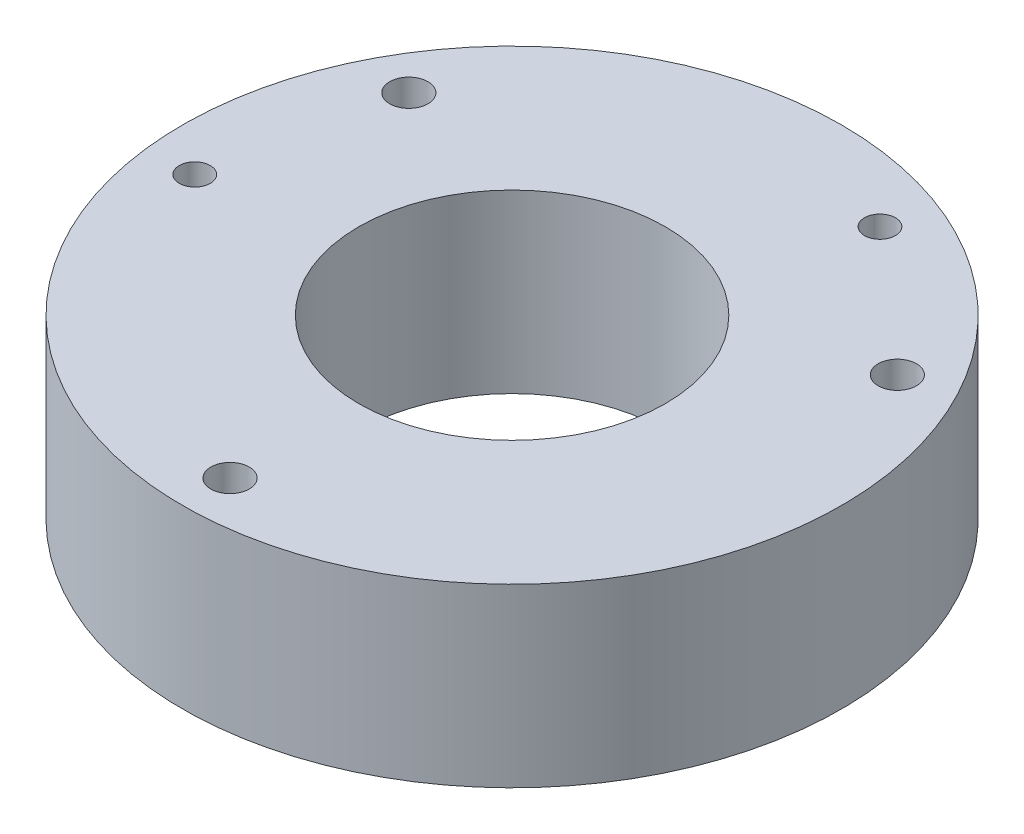
ISO-10303-21;
HEADER;
FILE_DESCRIPTION(('STEP AP214'),'2;1');
FILE_NAME('part.step','',(''),(''),'','','');
FILE_SCHEMA(('AUTOMOTIVE_DESIGN { 1 0 10303 214 1 1 1 1 }'));
ENDSEC;
DATA;
#1=APPLICATION_CONTEXT('core data for automotive mechanical design processes');
#2=APPLICATION_PROTOCOL_DEFINITION('international standard','automotive_design',2000,#1);
#3=PRODUCT_CONTEXT('',#1,'mechanical');
#4=PRODUCT('Part','Part','',(#3));
#5=PRODUCT_RELATED_PRODUCT_CATEGORY('part','',(#4));
#6=PRODUCT_DEFINITION_FORMATION('','',#4);
#7=PRODUCT_DEFINITION_CONTEXT('part definition',#1,'design');
#8=PRODUCT_DEFINITION('design','',#6,#7);
#9=PRODUCT_DEFINITION_SHAPE('','',#8);
#10=(LENGTH_UNIT() NAMED_UNIT(*) SI_UNIT(.MILLI.,.METRE.));
#11=(NAMED_UNIT(*) PLANE_ANGLE_UNIT() SI_UNIT($,.RADIAN.));
#12=(NAMED_UNIT(*) SI_UNIT($,.STERADIAN.) SOLID_ANGLE_UNIT());
#13=UNCERTAINTY_MEASURE_WITH_UNIT(LENGTH_MEASURE(1.E-05),#10,'distance_accuracy_value','');
#14=(GEOMETRIC_REPRESENTATION_CONTEXT(3) GLOBAL_UNCERTAINTY_ASSIGNED_CONTEXT((#13)) GLOBAL_UNIT_ASSIGNED_CONTEXT((#10,
#11,#12)) REPRESENTATION_CONTEXT('',''));
#15=CARTESIAN_POINT('',(0.,0.,0.));
#16=DIRECTION('',(0.,0.,1.));
#17=DIRECTION('',(1.,0.,0.));
#18=AXIS2_PLACEMENT_3D('',#15,#16,#17);
#19=CARTESIAN_POINT('',(5.1,4.99999999999545,-10.8));
#20=DIRECTION('',(0.,-1.,0.));
#21=DIRECTION('',(0.,0.,-1.));
#22=AXIS2_PLACEMENT_3D('',#19,#20,#21);
#23=CONICAL_SURFACE('',#22,0.900000000018919,1.0297442586507);
#24=CARTESIAN_POINT('',(5.1,5.54077455717561,-10.799999999989));
#25=VERTEX_POINT('',#24);
#26=VERTEX_LOOP('',#25);
#27=FACE_BOUND('',#26,.T.);
#28=CARTESIAN_POINT('',(5.1,4.99999999999999,-10.8));
#29=DIRECTION('',(0.,-1.,0.));
#30=DIRECTION('',(0.,0.,-1.));
#31=AXIS2_PLACEMENT_3D('',#28,#29,#30);
#32=CIRCLE('',#31,0.9);
#33=CARTESIAN_POINT('',(5.1,4.99999999999999,-11.7));
#34=VERTEX_POINT('',#33);
#35=EDGE_CURVE('E43',#34,#34,#32,.T.);
#36=ORIENTED_EDGE('',*,*,#35,.T.);
#37=EDGE_LOOP('',(#36));
#38=FACE_BOUND('',#37,.T.);
#39=ADVANCED_FACE('F16',(#27,#38),#23,.F.);
#40=CARTESIAN_POINT('',(-6.8,5.0000000000523,9.8));
#41=DIRECTION('',(0.,-1.,0.));
#42=DIRECTION('',(0.,0.,-1.));
#43=AXIS2_PLACEMENT_3D('',#40,#41,#42);
#44=CONICAL_SURFACE('',#43,0.899999999903504,1.02974425865986);
#45=CARTESIAN_POINT('',(-6.8,5.54077455714719,9.79999999995584));
#46=VERTEX_POINT('',#45);
#47=VERTEX_LOOP('',#46);
#48=FACE_BOUND('',#47,.T.);
#49=CARTESIAN_POINT('',(-6.8,4.99999999999999,9.8));
#50=DIRECTION('',(0.,-1.,0.));
#51=DIRECTION('',(0.,0.,-1.));
#52=AXIS2_PLACEMENT_3D('',#49,#50,#51);
#53=CIRCLE('',#52,0.9);
#54=CARTESIAN_POINT('',(-6.8,4.99999999999999,8.9));
#55=VERTEX_POINT('',#54);
#56=EDGE_CURVE('E45',#55,#55,#53,.T.);
#57=ORIENTED_EDGE('',*,*,#56,.T.);
#58=EDGE_LOOP('',(#57));
#59=FACE_BOUND('',#58,.T.);
#60=ADVANCED_FACE('F40',(#48,#59),#44,.F.);
#61=CARTESIAN_POINT('',(5.1,0.,-10.8));
#62=DIRECTION('',(0.,-1.,0.));
#63=DIRECTION('',(0.,0.,-1.));
#64=AXIS2_PLACEMENT_3D('',#61,#62,#63);
#65=CYLINDRICAL_SURFACE('',#64,0.9);
#66=ORIENTED_EDGE('',*,*,#35,.F.);
#67=EDGE_LOOP('',(#66));
#68=FACE_BOUND('',#67,.T.);
#69=CARTESIAN_POINT('',(5.1,3.,-10.8));
#70=DIRECTION('',(0.,-1.,0.));
#71=DIRECTION('',(0.,0.,-1.));
#72=AXIS2_PLACEMENT_3D('',#69,#70,#71);
#73=CIRCLE('',#72,0.9);
#74=CARTESIAN_POINT('',(5.1,3.,-11.7));
#75=VERTEX_POINT('',#74);
#76=EDGE_CURVE('E19',#75,#75,#73,.T.);
#77=ORIENTED_EDGE('',*,*,#76,.T.);
#78=EDGE_LOOP('',(#77));
#79=FACE_BOUND('',#78,.T.);
#80=ADVANCED_FACE('F116',(#68,#79),#65,.F.);
#81=CARTESIAN_POINT('',(-6.8,0.,9.8));
#82=DIRECTION('',(0.,-1.,0.));
#83=DIRECTION('',(0.,0.,-1.));
#84=AXIS2_PLACEMENT_3D('',#81,#82,#83);
#85=CYLINDRICAL_SURFACE('',#84,0.9);
#86=ORIENTED_EDGE('',*,*,#56,.F.);
#87=EDGE_LOOP('',(#86));
#88=FACE_BOUND('',#87,.T.);
#89=CARTESIAN_POINT('',(-6.8,3.,9.8));
#90=DIRECTION('',(0.,-1.,0.));
#91=DIRECTION('',(0.,0.,-1.));
#92=AXIS2_PLACEMENT_3D('',#89,#90,#91);
#93=CIRCLE('',#92,0.9);
#94=CARTESIAN_POINT('',(-6.8,3.,8.9));
#95=VERTEX_POINT('',#94);
#96=EDGE_CURVE('E107',#95,#95,#93,.T.);
#97=ORIENTED_EDGE('',*,*,#96,.T.);
#98=EDGE_LOOP('',(#97));
#99=FACE_BOUND('',#98,.T.);
#100=ADVANCED_FACE('F204',(#88,#99),#85,.F.);
#101=CARTESIAN_POINT('',(-18.3,6.49999999995998,2.4));
#102=DIRECTION('',(0.,1.,0.));
#103=DIRECTION('',(0.,0.,1.));
#104=AXIS2_PLACEMENT_3D('',#101,#102,#103);
#105=CONICAL_SURFACE('',#104,0.899999999910601,1.02974425851516);
#106=CARTESIAN_POINT('',(-18.3,5.95922544277983,2.40000000010809));
#107=VERTEX_POINT('',#106);
#108=VERTEX_LOOP('',#107);
#109=FACE_BOUND('',#108,.T.);
#110=CARTESIAN_POINT('',(-18.3,6.5,2.4));
#111=DIRECTION('',(0.,1.,0.));
#112=DIRECTION('',(0.,0.,1.));
#113=AXIS2_PLACEMENT_3D('',#110,#111,#112);
#114=CIRCLE('',#113,0.900000000000001);
#115=CARTESIAN_POINT('',(-18.3,6.5,3.3));
#116=VERTEX_POINT('',#115);
#117=EDGE_CURVE('E109',#116,#116,#114,.T.);
#118=ORIENTED_EDGE('',*,*,#117,.T.);
#119=EDGE_LOOP('',(#118));
#120=FACE_BOUND('',#119,.T.);
#121=ADVANCED_FACE('F132',(#109,#120),#105,.F.);
#122=CARTESIAN_POINT('',(7.,6.4999999998463,-17.));
#123=DIRECTION('',(0.,1.,0.));
#124=DIRECTION('',(-1.,0.,0.));
#125=AXIS2_PLACEMENT_3D('',#122,#123,#124);
#126=CONICAL_SURFACE('',#125,0.899999999778175,1.02974425840377);
#127=CARTESIAN_POINT('',(7.,5.95922544283667,-16.9999999997117));
#128=VERTEX_POINT('',#127);
#129=VERTEX_LOOP('',#128);
#130=FACE_BOUND('',#129,.T.);
#131=CARTESIAN_POINT('',(7.,6.5,-17.));
#132=DIRECTION('',(0.,1.,0.));
#133=DIRECTION('',(0.,0.,1.));
#134=AXIS2_PLACEMENT_3D('',#131,#132,#133);
#135=CIRCLE('',#134,0.900000000000001);
#136=CARTESIAN_POINT('',(7.,6.5,-16.1));
#137=VERTEX_POINT('',#136);
#138=EDGE_CURVE('E106',#137,#137,#135,.T.);
#139=ORIENTED_EDGE('',*,*,#138,.T.);
#140=EDGE_LOOP('',(#139));
#141=FACE_BOUND('',#140,.T.);
#142=ADVANCED_FACE('F121',(#130,#141),#126,.F.);
#143=CARTESIAN_POINT('',(6.,3.,-10.8));
#144=DIRECTION('',(0.,1.,0.));
#145=DIRECTION('',(0.,0.,1.));
#146=AXIS2_PLACEMENT_3D('',#143,#144,#145);
#147=PLANE('',#146);
#148=CARTESIAN_POINT('',(5.1,3.,-10.8));
#149=DIRECTION('',(0.,-1.,0.));
#150=DIRECTION('',(0.,0.,-1.));
#151=AXIS2_PLACEMENT_3D('',#148,#149,#150);
#152=CIRCLE('',#151,1.01);
#153=CARTESIAN_POINT('',(5.1,3.,-11.81));
#154=VERTEX_POINT('',#153);
#155=EDGE_CURVE('E104',#154,#154,#152,.T.);
#156=ORIENTED_EDGE('',*,*,#155,.T.);
#157=EDGE_LOOP('',(#156));
#158=FACE_BOUND('',#157,.T.);
#159=ORIENTED_EDGE('',*,*,#76,.F.);
#160=EDGE_LOOP('',(#159));
#161=FACE_BOUND('',#160,.T.);
#162=ADVANCED_FACE('F118',(#158,#161),#147,.F.);
#163=CARTESIAN_POINT('',(-5.9,3.,9.8));
#164=DIRECTION('',(0.,1.,0.));
#165=DIRECTION('',(0.,0.,1.));
#166=AXIS2_PLACEMENT_3D('',#163,#164,#165);
#167=PLANE('',#166);
#168=CARTESIAN_POINT('',(-6.8,3.,9.8));
#169=DIRECTION('',(0.,-1.,0.));
#170=DIRECTION('',(0.,0.,-1.));
#171=AXIS2_PLACEMENT_3D('',#168,#169,#170);
#172=CIRCLE('',#171,1.01);
#173=CARTESIAN_POINT('',(-6.8,3.,8.79));
#174=VERTEX_POINT('',#173);
#175=EDGE_CURVE('E101',#174,#174,#172,.T.);
#176=ORIENTED_EDGE('',*,*,#175,.T.);
#177=EDGE_LOOP('',(#176));
#178=FACE_BOUND('',#177,.T.);
#179=ORIENTED_EDGE('',*,*,#96,.F.);
#180=EDGE_LOOP('',(#179));
#181=FACE_BOUND('',#180,.T.);
#182=ADVANCED_FACE('F120',(#178,#181),#167,.F.);
#183=CARTESIAN_POINT('',(-18.3,11.5,2.4));
#184=DIRECTION('',(0.,1.,0.));
#185=DIRECTION('',(0.,0.,1.));
#186=AXIS2_PLACEMENT_3D('',#183,#184,#185);
#187=CYLINDRICAL_SURFACE('',#186,0.900000000000001);
#188=ORIENTED_EDGE('',*,*,#117,.F.);
#189=EDGE_LOOP('',(#188));
#190=FACE_BOUND('',#189,.T.);
#191=CARTESIAN_POINT('',(-18.3,8.5,2.4));
#192=DIRECTION('',(0.,1.,0.));
#193=DIRECTION('',(0.,0.,1.));
#194=AXIS2_PLACEMENT_3D('',#191,#192,#193);
#195=CIRCLE('',#194,0.900000000000001);
#196=CARTESIAN_POINT('',(-18.3,8.5,3.3));
#197=VERTEX_POINT('',#196);
#198=EDGE_CURVE('E98',#197,#197,#195,.T.);
#199=ORIENTED_EDGE('',*,*,#198,.T.);
#200=EDGE_LOOP('',(#199));
#201=FACE_BOUND('',#200,.T.);
#202=ADVANCED_FACE('F129',(#190,#201),#187,.F.);
#203=CARTESIAN_POINT('',(7.,11.5,-17.));
#204=DIRECTION('',(0.,1.,0.));
#205=DIRECTION('',(0.,0.,1.));
#206=AXIS2_PLACEMENT_3D('',#203,#204,#205);
#207=CYLINDRICAL_SURFACE('',#206,0.900000000000001);
#208=ORIENTED_EDGE('',*,*,#138,.F.);
#209=EDGE_LOOP('',(#208));
#210=FACE_BOUND('',#209,.T.);
#211=CARTESIAN_POINT('',(7.,8.5,-17.));
#212=DIRECTION('',(0.,1.,0.));
#213=DIRECTION('',(0.,0.,1.));
#214=AXIS2_PLACEMENT_3D('',#211,#212,#213);
#215=CIRCLE('',#214,0.900000000000001);
#216=CARTESIAN_POINT('',(7.,8.5,-16.1));
#217=VERTEX_POINT('',#216);
#218=EDGE_CURVE('E95',#217,#217,#215,.T.);
#219=ORIENTED_EDGE('',*,*,#218,.T.);
#220=EDGE_LOOP('',(#219));
#221=FACE_BOUND('',#220,.T.);
#222=ADVANCED_FACE('F189',(#210,#221),#207,.F.);
#223=CARTESIAN_POINT('',(5.1,0.,-10.8));
#224=DIRECTION('',(0.,-1.,0.));
#225=DIRECTION('',(0.,0.,-1.));
#226=AXIS2_PLACEMENT_3D('',#223,#224,#225);
#227=CYLINDRICAL_SURFACE('',#226,1.01);
#228=ORIENTED_EDGE('',*,*,#155,.F.);
#229=EDGE_LOOP('',(#228));
#230=FACE_BOUND('',#229,.T.);
#231=CARTESIAN_POINT('',(5.1,0.,-10.8));
#232=DIRECTION('',(0.,-1.,0.));
#233=DIRECTION('',(0.,0.,-1.));
#234=AXIS2_PLACEMENT_3D('',#231,#232,#233);
#235=CIRCLE('',#234,1.01);
#236=CARTESIAN_POINT('',(5.1,0.,-11.81));
#237=VERTEX_POINT('',#236);
#238=EDGE_CURVE('E92',#237,#237,#235,.T.);
#239=ORIENTED_EDGE('',*,*,#238,.T.);
#240=EDGE_LOOP('',(#239));
#241=FACE_BOUND('',#240,.T.);
#242=ADVANCED_FACE('F185',(#230,#241),#227,.F.);
#243=CARTESIAN_POINT('',(-6.8,0.,9.8));
#244=DIRECTION('',(0.,-1.,0.));
#245=DIRECTION('',(0.,0.,-1.));
#246=AXIS2_PLACEMENT_3D('',#243,#244,#245);
#247=CYLINDRICAL_SURFACE('',#246,1.01);
#248=ORIENTED_EDGE('',*,*,#175,.F.);
#249=EDGE_LOOP('',(#248));
#250=FACE_BOUND('',#249,.T.);
#251=CARTESIAN_POINT('',(-6.8,0.,9.8));
#252=DIRECTION('',(0.,-1.,0.));
#253=DIRECTION('',(0.,0.,-1.));
#254=AXIS2_PLACEMENT_3D('',#251,#252,#253);
#255=CIRCLE('',#254,1.01);
#256=CARTESIAN_POINT('',(-6.8,0.,8.79));
#257=VERTEX_POINT('',#256);
#258=EDGE_CURVE('E89',#257,#257,#255,.T.);
#259=ORIENTED_EDGE('',*,*,#258,.T.);
#260=EDGE_LOOP('',(#259));
#261=FACE_BOUND('',#260,.T.);
#262=ADVANCED_FACE('F181',(#250,#261),#247,.F.);
#263=CARTESIAN_POINT('',(-17.4,8.5,2.4));
#264=DIRECTION('',(0.,-1.,0.));
#265=DIRECTION('',(0.,0.,-1.));
#266=AXIS2_PLACEMENT_3D('',#263,#264,#265);
#267=PLANE('',#266);
#268=CARTESIAN_POINT('',(-18.3,8.5,2.4));
#269=DIRECTION('',(0.,1.,0.));
#270=DIRECTION('',(0.,0.,1.));
#271=AXIS2_PLACEMENT_3D('',#268,#269,#270);
#272=CIRCLE('',#271,1.01);
#273=CARTESIAN_POINT('',(-18.3,8.5,3.41));
#274=VERTEX_POINT('',#273);
#275=EDGE_CURVE('E86',#274,#274,#272,.T.);
#276=ORIENTED_EDGE('',*,*,#275,.T.);
#277=EDGE_LOOP('',(#276));
#278=FACE_BOUND('',#277,.T.);
#279=ORIENTED_EDGE('',*,*,#198,.F.);
#280=EDGE_LOOP('',(#279));
#281=FACE_BOUND('',#280,.T.);
#282=ADVANCED_FACE('F177',(#278,#281),#267,.F.);
#283=CARTESIAN_POINT('',(7.9,8.5,-17.));
#284=DIRECTION('',(0.,-1.,0.));
#285=DIRECTION('',(0.,0.,-1.));
#286=AXIS2_PLACEMENT_3D('',#283,#284,#285);
#287=PLANE('',#286);
#288=CARTESIAN_POINT('',(7.,8.5,-17.));
#289=DIRECTION('',(0.,1.,0.));
#290=DIRECTION('',(0.,0.,1.));
#291=AXIS2_PLACEMENT_3D('',#288,#289,#290);
#292=CIRCLE('',#291,1.01);
#293=CARTESIAN_POINT('',(7.,8.5,-15.99));
#294=VERTEX_POINT('',#293);
#295=EDGE_CURVE('E83',#294,#294,#292,.T.);
#296=ORIENTED_EDGE('',*,*,#295,.T.);
#297=EDGE_LOOP('',(#296));
#298=FACE_BOUND('',#297,.T.);
#299=ORIENTED_EDGE('',*,*,#218,.F.);
#300=EDGE_LOOP('',(#299));
#301=FACE_BOUND('',#300,.T.);
#302=ADVANCED_FACE('F173',(#298,#301),#287,.F.);
#303=CARTESIAN_POINT('',(0.,0.,0.));
#304=DIRECTION('',(0.,1.,0.));
#305=DIRECTION('',(0.,0.,1.));
#306=AXIS2_PLACEMENT_3D('',#303,#304,#305);
#307=PLANE('',#306);
#308=CARTESIAN_POINT('',(0.,0.,0.));
#309=DIRECTION('',(0.,-1.,0.));
#310=DIRECTION('',(0.,0.,-1.));
#311=AXIS2_PLACEMENT_3D('',#308,#309,#310);
#312=CIRCLE('',#311,10.);
#313=CARTESIAN_POINT('',(0.,0.,-10.));
#314=VERTEX_POINT('',#313);
#315=EDGE_CURVE('E68',#314,#314,#312,.F.);
#316=ORIENTED_EDGE('',*,*,#315,.T.);
#317=EDGE_LOOP('',(#316));
#318=FACE_BOUND('',#317,.T.);
#319=CARTESIAN_POINT('',(0.,0.,0.));
#320=DIRECTION('',(0.,-1.,0.));
#321=DIRECTION('',(0.,0.,-1.));
#322=AXIS2_PLACEMENT_3D('',#319,#320,#321);
#323=CIRCLE('',#322,21.5);
#324=CARTESIAN_POINT('',(0.,0.,-21.5));
#325=VERTEX_POINT('',#324);
#326=EDGE_CURVE('E71',#325,#325,#323,.F.);
#327=ORIENTED_EDGE('',*,*,#326,.F.);
#328=EDGE_LOOP('',(#327));
#329=FACE_BOUND('',#328,.T.);
#330=CARTESIAN_POINT('',(0.,0.,18.4));
#331=DIRECTION('',(0.,1.,0.));
#332=DIRECTION('',(0.,0.,1.));
#333=AXIS2_PLACEMENT_3D('',#330,#331,#332);
#334=CIRCLE('',#333,1.24999999999999);
#335=CARTESIAN_POINT('',(0.,0.,19.65));
#336=VERTEX_POINT('',#335);
#337=EDGE_CURVE('E74',#336,#336,#334,.T.);
#338=ORIENTED_EDGE('',*,*,#337,.T.);
#339=EDGE_LOOP('',(#338));
#340=FACE_BOUND('',#339,.T.);
#341=CARTESIAN_POINT('',(15.9348674296336,0.,-9.20000000000008));
#342=DIRECTION('',(0.,1.,0.));
#343=DIRECTION('',(0.,0.,1.));
#344=AXIS2_PLACEMENT_3D('',#341,#342,#343);
#345=CIRCLE('',#344,1.24999999999999);
#346=CARTESIAN_POINT('',(15.9348674296336,0.,-7.95000000000009));
#347=VERTEX_POINT('',#346);
#348=EDGE_CURVE('E77',#347,#347,#345,.T.);
#349=ORIENTED_EDGE('',*,*,#348,.T.);
#350=EDGE_LOOP('',(#349));
#351=FACE_BOUND('',#350,.T.);
#352=CARTESIAN_POINT('',(-15.9348674296336,0.,-9.20000000000007));
#353=DIRECTION('',(0.,1.,0.));
#354=DIRECTION('',(0.,0.,1.));
#355=AXIS2_PLACEMENT_3D('',#352,#353,#354);
#356=CIRCLE('',#355,1.24999999999999);
#357=CARTESIAN_POINT('',(-15.9348674296336,0.,-7.95000000000008));
#358=VERTEX_POINT('',#357);
#359=EDGE_CURVE('E80',#358,#358,#356,.T.);
#360=ORIENTED_EDGE('',*,*,#359,.T.);
#361=EDGE_LOOP('',(#360));
#362=FACE_BOUND('',#361,.T.);
#363=ORIENTED_EDGE('',*,*,#258,.F.);
#364=EDGE_LOOP('',(#363));
#365=FACE_BOUND('',#364,.T.);
#366=ORIENTED_EDGE('',*,*,#238,.F.);
#367=EDGE_LOOP('',(#366));
#368=FACE_BOUND('',#367,.T.);
#369=ADVANCED_FACE('F169',(#318,#329,#340,#351,#362,#365,#368),#307,.F.);
#370=CARTESIAN_POINT('',(-18.3,11.5,2.4));
#371=DIRECTION('',(0.,1.,0.));
#372=DIRECTION('',(0.,0.,1.));
#373=AXIS2_PLACEMENT_3D('',#370,#371,#372);
#374=CYLINDRICAL_SURFACE('',#373,1.01);
#375=CARTESIAN_POINT('',(-18.3,11.5,2.4));
#376=DIRECTION('',(0.,1.,0.));
#377=DIRECTION('',(0.,0.,1.));
#378=AXIS2_PLACEMENT_3D('',#375,#376,#377);
#379=CIRCLE('',#378,1.01);
#380=CARTESIAN_POINT('',(-18.3,11.5,3.41));
#381=VERTEX_POINT('',#380);
#382=EDGE_CURVE('E65',#381,#381,#379,.F.);
#383=ORIENTED_EDGE('',*,*,#382,.F.);
#384=EDGE_LOOP('',(#383));
#385=FACE_BOUND('',#384,.T.);
#386=ORIENTED_EDGE('',*,*,#275,.F.);
#387=EDGE_LOOP('',(#386));
#388=FACE_BOUND('',#387,.T.);
#389=ADVANCED_FACE('F165',(#385,#388),#374,.F.);
#390=CARTESIAN_POINT('',(7.,11.5,-17.));
#391=DIRECTION('',(0.,1.,0.));
#392=DIRECTION('',(0.,0.,1.));
#393=AXIS2_PLACEMENT_3D('',#390,#391,#392);
#394=CYLINDRICAL_SURFACE('',#393,1.01);
#395=CARTESIAN_POINT('',(7.,11.5,-17.));
#396=DIRECTION('',(0.,1.,0.));
#397=DIRECTION('',(0.,0.,1.));
#398=AXIS2_PLACEMENT_3D('',#395,#396,#397);
#399=CIRCLE('',#398,1.01);
#400=CARTESIAN_POINT('',(7.,11.5,-15.99));
#401=VERTEX_POINT('',#400);
#402=EDGE_CURVE('E62',#401,#401,#399,.F.);
#403=ORIENTED_EDGE('',*,*,#402,.F.);
#404=EDGE_LOOP('',(#403));
#405=FACE_BOUND('',#404,.T.);
#406=ORIENTED_EDGE('',*,*,#295,.F.);
#407=EDGE_LOOP('',(#406));
#408=FACE_BOUND('',#407,.T.);
#409=ADVANCED_FACE('F161',(#405,#408),#394,.F.);
#410=CARTESIAN_POINT('',(-15.9348674296336,11.5,-9.20000000000007));
#411=DIRECTION('',(0.,1.,0.));
#412=DIRECTION('',(0.,0.,1.));
#413=AXIS2_PLACEMENT_3D('',#410,#411,#412);
#414=CYLINDRICAL_SURFACE('',#413,1.24999999999999);
#415=CARTESIAN_POINT('',(-15.9348674296336,11.5,-9.20000000000007));
#416=DIRECTION('',(0.,1.,0.));
#417=DIRECTION('',(0.,0.,1.));
#418=AXIS2_PLACEMENT_3D('',#415,#416,#417);
#419=CIRCLE('',#418,1.24999999999999);
#420=CARTESIAN_POINT('',(-15.9348674296336,11.5,-7.95000000000008));
#421=VERTEX_POINT('',#420);
#422=EDGE_CURVE('E59',#421,#421,#419,.F.);
#423=ORIENTED_EDGE('',*,*,#422,.F.);
#424=EDGE_LOOP('',(#423));
#425=FACE_BOUND('',#424,.T.);
#426=ORIENTED_EDGE('',*,*,#359,.F.);
#427=EDGE_LOOP('',(#426));
#428=FACE_BOUND('',#427,.T.);
#429=ADVANCED_FACE('F157',(#425,#428),#414,.F.);
#430=CARTESIAN_POINT('',(15.9348674296336,11.5,-9.20000000000008));
#431=DIRECTION('',(0.,1.,0.));
#432=DIRECTION('',(0.,0.,1.));
#433=AXIS2_PLACEMENT_3D('',#430,#431,#432);
#434=CYLINDRICAL_SURFACE('',#433,1.24999999999999);
#435=CARTESIAN_POINT('',(15.9348674296336,11.5,-9.20000000000008));
#436=DIRECTION('',(0.,1.,0.));
#437=DIRECTION('',(0.,0.,1.));
#438=AXIS2_PLACEMENT_3D('',#435,#436,#437);
#439=CIRCLE('',#438,1.24999999999999);
#440=CARTESIAN_POINT('',(15.9348674296336,11.5,-7.95000000000009));
#441=VERTEX_POINT('',#440);
#442=EDGE_CURVE('E56',#441,#441,#439,.F.);
#443=ORIENTED_EDGE('',*,*,#442,.F.);
#444=EDGE_LOOP('',(#443));
#445=FACE_BOUND('',#444,.T.);
#446=ORIENTED_EDGE('',*,*,#348,.F.);
#447=EDGE_LOOP('',(#446));
#448=FACE_BOUND('',#447,.T.);
#449=ADVANCED_FACE('F153',(#445,#448),#434,.F.);
#450=CARTESIAN_POINT('',(0.,11.5,18.4));
#451=DIRECTION('',(0.,1.,0.));
#452=DIRECTION('',(0.,0.,1.));
#453=AXIS2_PLACEMENT_3D('',#450,#451,#452);
#454=CYLINDRICAL_SURFACE('',#453,1.24999999999999);
#455=CARTESIAN_POINT('',(0.,11.5,18.4));
#456=DIRECTION('',(0.,1.,0.));
#457=DIRECTION('',(0.,0.,1.));
#458=AXIS2_PLACEMENT_3D('',#455,#456,#457);
#459=CIRCLE('',#458,1.24999999999999);
#460=CARTESIAN_POINT('',(0.,11.5,19.65));
#461=VERTEX_POINT('',#460);
#462=EDGE_CURVE('E53',#461,#461,#459,.F.);
#463=ORIENTED_EDGE('',*,*,#462,.F.);
#464=EDGE_LOOP('',(#463));
#465=FACE_BOUND('',#464,.T.);
#466=ORIENTED_EDGE('',*,*,#337,.F.);
#467=EDGE_LOOP('',(#466));
#468=FACE_BOUND('',#467,.T.);
#469=ADVANCED_FACE('F149',(#465,#468),#454,.F.);
#470=CARTESIAN_POINT('',(0.,11.5,0.));
#471=DIRECTION('',(0.,-1.,0.));
#472=DIRECTION('',(0.,0.,-1.));
#473=AXIS2_PLACEMENT_3D('',#470,#471,#472);
#474=CYLINDRICAL_SURFACE('',#473,21.5);
#475=ORIENTED_EDGE('',*,*,#326,.T.);
#476=EDGE_LOOP('',(#475));
#477=FACE_BOUND('',#476,.T.);
#478=CARTESIAN_POINT('',(0.,11.5,0.));
#479=DIRECTION('',(0.,-1.,0.));
#480=DIRECTION('',(0.,0.,-1.));
#481=AXIS2_PLACEMENT_3D('',#478,#479,#480);
#482=CIRCLE('',#481,21.5);
#483=CARTESIAN_POINT('',(0.,11.5,-21.5));
#484=VERTEX_POINT('',#483);
#485=EDGE_CURVE('E25',#484,#484,#482,.F.);
#486=ORIENTED_EDGE('',*,*,#485,.F.);
#487=EDGE_LOOP('',(#486));
#488=FACE_BOUND('',#487,.T.);
#489=ADVANCED_FACE('F142',(#477,#488),#474,.T.);
#490=CARTESIAN_POINT('',(0.,11.5,0.));
#491=DIRECTION('',(0.,-1.,0.));
#492=DIRECTION('',(0.,0.,-1.));
#493=AXIS2_PLACEMENT_3D('',#490,#491,#492);
#494=CYLINDRICAL_SURFACE('',#493,10.);
#495=CARTESIAN_POINT('',(0.,11.5,0.));
#496=DIRECTION('',(0.,-1.,0.));
#497=DIRECTION('',(0.,0.,-1.));
#498=AXIS2_PLACEMENT_3D('',#495,#496,#497);
#499=CIRCLE('',#498,10.);
#500=CARTESIAN_POINT('',(0.,11.5,-10.));
#501=VERTEX_POINT('',#500);
#502=EDGE_CURVE('E11',#501,#501,#499,.T.);
#503=ORIENTED_EDGE('',*,*,#502,.F.);
#504=EDGE_LOOP('',(#503));
#505=FACE_BOUND('',#504,.T.);
#506=ORIENTED_EDGE('',*,*,#315,.F.);
#507=EDGE_LOOP('',(#506));
#508=FACE_BOUND('',#507,.T.);
#509=ADVANCED_FACE('F136',(#505,#508),#494,.F.);
#510=CARTESIAN_POINT('',(0.,11.5,0.));
#511=DIRECTION('',(0.,1.,0.));
#512=DIRECTION('',(0.,0.,1.));
#513=AXIS2_PLACEMENT_3D('',#510,#511,#512);
#514=PLANE('',#513);
#515=ORIENTED_EDGE('',*,*,#502,.T.);
#516=EDGE_LOOP('',(#515));
#517=FACE_BOUND('',#516,.T.);
#518=ORIENTED_EDGE('',*,*,#485,.T.);
#519=EDGE_LOOP('',(#518));
#520=FACE_BOUND('',#519,.T.);
#521=ORIENTED_EDGE('',*,*,#462,.T.);
#522=EDGE_LOOP('',(#521));
#523=FACE_BOUND('',#522,.T.);
#524=ORIENTED_EDGE('',*,*,#442,.T.);
#525=EDGE_LOOP('',(#524));
#526=FACE_BOUND('',#525,.T.);
#527=ORIENTED_EDGE('',*,*,#422,.T.);
#528=EDGE_LOOP('',(#527));
#529=FACE_BOUND('',#528,.T.);
#530=ORIENTED_EDGE('',*,*,#402,.T.);
#531=EDGE_LOOP('',(#530));
#532=FACE_BOUND('',#531,.T.);
#533=ORIENTED_EDGE('',*,*,#382,.T.);
#534=EDGE_LOOP('',(#533));
#535=FACE_BOUND('',#534,.T.);
#536=ADVANCED_FACE('F134',(#517,#520,#523,#526,#529,#532,#535),#514,.T.);
#537=CLOSED_SHELL('',(#39,#60,#80,#100,#121,#142,#162,#182,#202,#222,#242,#262,#282,#302,#369,
#389,#409,#429,#449,#469,#489,#509,#536));
#538=MANIFOLD_SOLID_BREP('B1',#537);
#539=ADVANCED_BREP_SHAPE_REPRESENTATION('',(#18,#538),#14);
#540=SHAPE_DEFINITION_REPRESENTATION(#9,#539);
ENDSEC;
END-ISO-10303-21;
